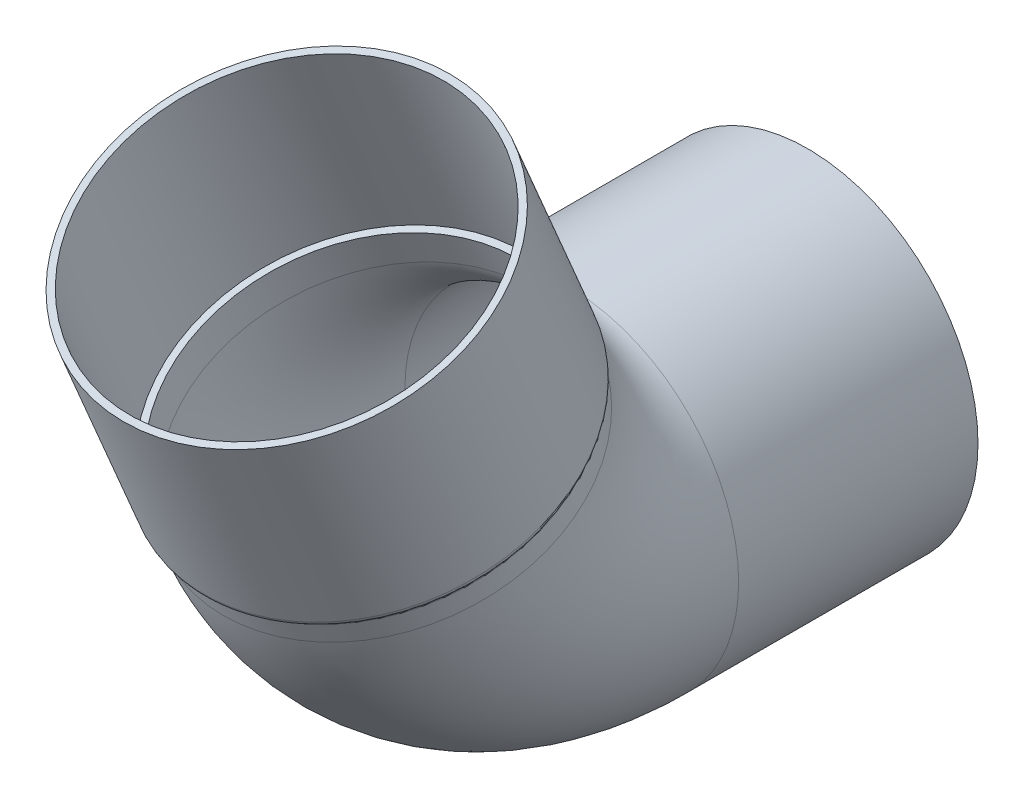
ISO-10303-21;
HEADER;
FILE_DESCRIPTION(('STEP AP214'),'2;1');
FILE_NAME('part.step','',(''),(''),'','','');
FILE_SCHEMA(('AUTOMOTIVE_DESIGN { 1 0 10303 214 1 1 1 1 }'));
ENDSEC;
DATA;
#1=APPLICATION_CONTEXT('core data for automotive mechanical design processes');
#2=APPLICATION_PROTOCOL_DEFINITION('international standard','automotive_design',2000,#1);
#3=PRODUCT_CONTEXT('',#1,'mechanical');
#4=PRODUCT('Part','Part','',(#3));
#5=PRODUCT_RELATED_PRODUCT_CATEGORY('part','',(#4));
#6=PRODUCT_DEFINITION_FORMATION('','',#4);
#7=PRODUCT_DEFINITION_CONTEXT('part definition',#1,'design');
#8=PRODUCT_DEFINITION('design','',#6,#7);
#9=PRODUCT_DEFINITION_SHAPE('','',#8);
#10=(LENGTH_UNIT() NAMED_UNIT(*) SI_UNIT(.MILLI.,.METRE.));
#11=(NAMED_UNIT(*) PLANE_ANGLE_UNIT() SI_UNIT($,.RADIAN.));
#12=(NAMED_UNIT(*) SI_UNIT($,.STERADIAN.) SOLID_ANGLE_UNIT());
#13=UNCERTAINTY_MEASURE_WITH_UNIT(LENGTH_MEASURE(1.E-05),#10,'distance_accuracy_value','');
#14=(GEOMETRIC_REPRESENTATION_CONTEXT(3) GLOBAL_UNCERTAINTY_ASSIGNED_CONTEXT((#13)) GLOBAL_UNIT_ASSIGNED_CONTEXT((#10,
#11,#12)) REPRESENTATION_CONTEXT('',''));
#15=CARTESIAN_POINT('',(0.,0.,0.));
#16=DIRECTION('',(0.,0.,1.));
#17=DIRECTION('',(1.,0.,0.));
#18=AXIS2_PLACEMENT_3D('',#15,#16,#17);
#19=CARTESIAN_POINT('',(0.,18.2780661453218,62.7585787677024));
#20=DIRECTION('',(0.,0.920504853452442,0.390731128489271));
#21=DIRECTION('',(0.,-0.390731128489271,0.920504853452442));
#22=AXIS2_PLACEMENT_3D('',#19,#20,#21);
#23=CYLINDRICAL_SURFACE('',#22,25.);
#24=CARTESIAN_POINT('',(0.,21.1716116294062,63.9868159552533));
#25=DIRECTION('',(0.,0.920504853452441,0.390731128489272));
#26=DIRECTION('',(0.,-0.390731128489272,0.920504853452441));
#27=AXIS2_PLACEMENT_3D('',#24,#25,#26);
#28=CIRCLE('',#27,25.);
#29=CARTESIAN_POINT('',(0.,11.4033334171744,86.9994372915643));
#30=VERTEX_POINT('',#29);
#31=EDGE_CURVE('E54',#30,#30,#28,.F.);
#32=ORIENTED_EDGE('',*,*,#31,.T.);
#33=EDGE_LOOP('',(#32));
#34=FACE_BOUND('',#33,.T.);
#35=CARTESIAN_POINT('',(0.,18.2780661453218,62.7585787677024));
#36=DIRECTION('',(0.,0.920504853452441,0.390731128489272));
#37=DIRECTION('',(1.,0.,0.));
#38=AXIS2_PLACEMENT_3D('',#35,#36,#37);
#39=CIRCLE('',#38,25.);
#40=CARTESIAN_POINT('',(0.,8.50978793309004,85.7712001040135));
#41=VERTEX_POINT('',#40);
#42=EDGE_CURVE('E63',#41,#41,#39,.T.);
#43=ORIENTED_EDGE('',*,*,#42,.T.);
#44=EDGE_LOOP('',(#43));
#45=FACE_BOUND('',#44,.T.);
#46=ADVANCED_FACE('F43',(#34,#45),#23,.T.);
#47=CARTESIAN_POINT('',(0.,30.,35.1434331641292));
#48=DIRECTION('',(-1.,0.,0.));
#49=DIRECTION('',(0.,0.,1.));
#50=AXIS2_PLACEMENT_3D('',#47,#48,#49);
#51=TOROIDAL_SURFACE('',#50,30.,25.);
#52=CARTESIAN_POINT('',(0.,0.,35.1434331641292));
#53=DIRECTION('',(0.,0.,1.));
#54=DIRECTION('',(1.,0.,0.));
#55=AXIS2_PLACEMENT_3D('',#52,#53,#54);
#56=CIRCLE('',#55,25.);
#57=CARTESIAN_POINT('',(0.,-25.,35.1434331641292));
#58=VERTEX_POINT('',#57);
#59=EDGE_CURVE('E66',#58,#58,#56,.T.);
#60=CARTESIAN_POINT('',(0.,30.,35.1434331641292));
#61=DIRECTION('',(-1.,0.,0.));
#62=DIRECTION('',(0.,0.,1.));
#63=AXIS2_PLACEMENT_3D('',#60,#61,#62);
#64=CIRCLE('',#63,55.);
#65=EDGE_CURVE('',#58,#41,#64,.T.);
#66=ORIENTED_EDGE('',*,*,#59,.T.);
#67=ORIENTED_EDGE('',*,*,#42,.F.);
#68=ORIENTED_EDGE('',*,*,#65,.T.);
#69=ORIENTED_EDGE('',*,*,#65,.F.);
#70=EDGE_LOOP('',(#66,#68,#67,#69));
#71=FACE_BOUND('',#70,.T.);
#72=ADVANCED_FACE('F109',(#71),#51,.T.);
#73=CARTESIAN_POINT('',(0.,0.,35.1434331641292));
#74=DIRECTION('',(0.,0.,-1.));
#75=DIRECTION('',(0.,1.,0.));
#76=AXIS2_PLACEMENT_3D('',#73,#74,#75);
#77=CYLINDRICAL_SURFACE('',#76,25.);
#78=ORIENTED_EDGE('',*,*,#59,.F.);
#79=EDGE_LOOP('',(#78));
#80=FACE_BOUND('',#79,.T.);
#81=CARTESIAN_POINT('',(0.,0.,0.));
#82=DIRECTION('',(0.,0.,1.));
#83=DIRECTION('',(1.,0.,0.));
#84=AXIS2_PLACEMENT_3D('',#81,#82,#83);
#85=CIRCLE('',#84,25.);
#86=CARTESIAN_POINT('',(25.,0.,0.));
#87=VERTEX_POINT('',#86);
#88=EDGE_CURVE('E67',#87,#87,#85,.T.);
#89=ORIENTED_EDGE('',*,*,#88,.T.);
#90=EDGE_LOOP('',(#89));
#91=FACE_BOUND('',#90,.T.);
#92=ADVANCED_FACE('F115',(#80,#91),#77,.T.);
#93=CARTESIAN_POINT('',(0.,0.,0.));
#94=DIRECTION('',(0.,0.,1.));
#95=DIRECTION('',(1.,0.,0.));
#96=AXIS2_PLACEMENT_3D('',#93,#94,#95);
#97=PLANE('',#96);
#98=CARTESIAN_POINT('',(0.,0.,0.));
#99=DIRECTION('',(0.,0.,1.));
#100=DIRECTION('',(1.,0.,0.));
#101=AXIS2_PLACEMENT_3D('',#98,#99,#100);
#102=CIRCLE('',#101,24.);
#103=CARTESIAN_POINT('',(24.,0.,0.));
#104=VERTEX_POINT('',#103);
#105=EDGE_CURVE('E73',#104,#104,#102,.T.);
#106=ORIENTED_EDGE('',*,*,#105,.T.);
#107=EDGE_LOOP('',(#106));
#108=FACE_BOUND('',#107,.T.);
#109=ORIENTED_EDGE('',*,*,#88,.F.);
#110=EDGE_LOOP('',(#109));
#111=FACE_BOUND('',#110,.T.);
#112=ADVANCED_FACE('F178',(#108,#111),#97,.F.);
#113=CARTESIAN_POINT('',(0.,18.2780661453218,62.7585787677024));
#114=DIRECTION('',(0.,0.920504853452442,0.390731128489271));
#115=DIRECTION('',(0.,-0.390731128489271,0.920504853452442));
#116=AXIS2_PLACEMENT_3D('',#113,#114,#115);
#117=CYLINDRICAL_SURFACE('',#116,24.);
#118=CARTESIAN_POINT('',(0.,18.2780661453218,62.7585787677024));
#119=DIRECTION('',(0.,0.920504853452442,0.390731128489271));
#120=DIRECTION('',(0.,-0.390731128489271,0.920504853452442));
#121=AXIS2_PLACEMENT_3D('',#118,#119,#120);
#122=CIRCLE('',#121,24.);
#123=CARTESIAN_POINT('',(0.,8.90051906157931,84.850695250561));
#124=VERTEX_POINT('',#123);
#125=EDGE_CURVE('E70',#124,#124,#122,.T.);
#126=ORIENTED_EDGE('',*,*,#125,.F.);
#127=EDGE_LOOP('',(#126));
#128=FACE_BOUND('',#127,.T.);
#129=CARTESIAN_POINT('',(0.,23.012621336311,64.7682782122318));
#130=DIRECTION('',(0.,0.920504853452441,0.390731128489272));
#131=DIRECTION('',(0.,-0.390731128489272,0.920504853452441));
#132=AXIS2_PLACEMENT_3D('',#129,#130,#131);
#133=CIRCLE('',#132,24.);
#134=CARTESIAN_POINT('',(0.,13.6350742525685,86.8603946950904));
#135=VERTEX_POINT('',#134);
#136=EDGE_CURVE('E77',#135,#135,#133,.T.);
#137=ORIENTED_EDGE('',*,*,#136,.T.);
#138=EDGE_LOOP('',(#137));
#139=FACE_BOUND('',#138,.T.);
#140=ADVANCED_FACE('F173',(#128,#139),#117,.F.);
#141=CARTESIAN_POINT('',(0.,30.,35.1434331641292));
#142=DIRECTION('',(-1.,0.,0.));
#143=DIRECTION('',(0.,0.,1.));
#144=AXIS2_PLACEMENT_3D('',#141,#142,#143);
#145=TOROIDAL_SURFACE('',#144,30.,24.);
#146=CARTESIAN_POINT('',(0.,0.,35.1434331641292));
#147=DIRECTION('',(0.,0.,-1.));
#148=DIRECTION('',(0.,1.,0.));
#149=AXIS2_PLACEMENT_3D('',#146,#147,#148);
#150=CIRCLE('',#149,24.);
#151=CARTESIAN_POINT('',(0.,-24.,35.1434331641292));
#152=VERTEX_POINT('',#151);
#153=EDGE_CURVE('E76',#152,#152,#150,.F.);
#154=CARTESIAN_POINT('',(0.,30.,35.1434331641292));
#155=DIRECTION('',(-1.,0.,0.));
#156=DIRECTION('',(0.,0.,1.));
#157=AXIS2_PLACEMENT_3D('',#154,#155,#156);
#158=CIRCLE('',#157,54.);
#159=EDGE_CURVE('',#152,#124,#158,.T.);
#160=ORIENTED_EDGE('',*,*,#153,.F.);
#161=ORIENTED_EDGE('',*,*,#125,.T.);
#162=ORIENTED_EDGE('',*,*,#159,.T.);
#163=ORIENTED_EDGE('',*,*,#159,.F.);
#164=EDGE_LOOP('',(#160,#162,#161,#163));
#165=FACE_BOUND('',#164,.T.);
#166=ADVANCED_FACE('F177',(#165),#145,.F.);
#167=CARTESIAN_POINT('',(0.,0.,35.1434331641292));
#168=DIRECTION('',(0.,0.,-1.));
#169=DIRECTION('',(0.,1.,0.));
#170=AXIS2_PLACEMENT_3D('',#167,#168,#169);
#171=CYLINDRICAL_SURFACE('',#170,24.);
#172=ORIENTED_EDGE('',*,*,#153,.T.);
#173=EDGE_LOOP('',(#172));
#174=FACE_BOUND('',#173,.T.);
#175=ORIENTED_EDGE('',*,*,#105,.F.);
#176=EDGE_LOOP('',(#175));
#177=FACE_BOUND('',#176,.T.);
#178=ADVANCED_FACE('F166',(#174,#177),#171,.F.);
#179=CARTESIAN_POINT('',(0.,23.012621336311,64.7682782122318));
#180=DIRECTION('',(0.,0.920504853452441,0.390731128489272));
#181=DIRECTION('',(0.,-0.390731128489272,0.920504853452441));
#182=AXIS2_PLACEMENT_3D('',#179,#180,#181);
#183=PLANE('',#182);
#184=CARTESIAN_POINT('',(0.,23.0126213363111,64.7682782122318));
#185=DIRECTION('',(0.,0.920504853452441,0.390731128489272));
#186=DIRECTION('',(0.,-0.390731128489272,0.920504853452441));
#187=AXIS2_PLACEMENT_3D('',#184,#185,#186);
#188=CIRCLE('',#187,25.);
#189=CARTESIAN_POINT('',(0.,13.2443431240793,87.7808995485428));
#190=VERTEX_POINT('',#189);
#191=EDGE_CURVE('E58',#190,#190,#188,.F.);
#192=ORIENTED_EDGE('',*,*,#191,.F.);
#193=EDGE_LOOP('',(#192));
#194=FACE_BOUND('',#193,.T.);
#195=ORIENTED_EDGE('',*,*,#136,.F.);
#196=EDGE_LOOP('',(#195));
#197=FACE_BOUND('',#196,.T.);
#198=ADVANCED_FACE('F105',(#194,#197),#183,.T.);
#199=CARTESIAN_POINT('',(0.,23.012621336311,64.7682782122318));
#200=DIRECTION('',(0.,-0.920504853452441,-0.390731128489272));
#201=DIRECTION('',(0.,0.390731128489272,-0.920504853452441));
#202=AXIS2_PLACEMENT_3D('',#199,#200,#201);
#203=CYLINDRICAL_SURFACE('',#202,26.);
#204=CARTESIAN_POINT('',(0.,22.7659728042,64.6635821218956));
#205=DIRECTION('',(0.,-0.920504853452441,-0.390731128489272));
#206=DIRECTION('',(0.,0.390731128489272,-0.920504853452441));
#207=AXIS2_PLACEMENT_3D('',#204,#205,#206);
#208=CIRCLE('',#207,26.);
#209=CARTESIAN_POINT('',(0.,32.924982144921,40.7304559321321));
#210=VERTEX_POINT('',#209);
#211=EDGE_CURVE('E50',#210,#210,#208,.F.);
#212=ORIENTED_EDGE('',*,*,#211,.T.);
#213=EDGE_LOOP('',(#212));
#214=FACE_BOUND('',#213,.T.);
#215=CARTESIAN_POINT('',(0.,50.6277669398843,76.4902120669099));
#216=DIRECTION('',(0.,0.920504853452441,0.390731128489272));
#217=DIRECTION('',(0.,-0.390731128489272,0.920504853452441));
#218=AXIS2_PLACEMENT_3D('',#215,#216,#217);
#219=CIRCLE('',#218,26.);
#220=CARTESIAN_POINT('',(0.,40.4687575991632,100.423338256673));
#221=VERTEX_POINT('',#220);
#222=EDGE_CURVE('E84',#221,#221,#219,.T.);
#223=ORIENTED_EDGE('',*,*,#222,.F.);
#224=EDGE_LOOP('',(#223));
#225=FACE_BOUND('',#224,.T.);
#226=ADVANCED_FACE('F96',(#214,#225),#203,.T.);
#227=CARTESIAN_POINT('',(0.,50.6277669398843,76.4902120669099));
#228=DIRECTION('',(0.,0.920504853452441,0.390731128489272));
#229=DIRECTION('',(0.,-0.390731128489272,0.920504853452441));
#230=AXIS2_PLACEMENT_3D('',#227,#228,#229);
#231=PLANE('',#230);
#232=ORIENTED_EDGE('',*,*,#222,.T.);
#233=EDGE_LOOP('',(#232));
#234=FACE_BOUND('',#233,.T.);
#235=CARTESIAN_POINT('',(0.,50.6277669398843,76.4902120669099));
#236=DIRECTION('',(0.,0.920504853452441,0.390731128489272));
#237=DIRECTION('',(1.,0.,0.));
#238=AXIS2_PLACEMENT_3D('',#235,#236,#237);
#239=CIRCLE('',#238,25.);
#240=CARTESIAN_POINT('',(25.,50.6277669398843,76.4902120669099));
#241=VERTEX_POINT('',#240);
#242=EDGE_CURVE('E87',#241,#241,#239,.T.);
#243=ORIENTED_EDGE('',*,*,#242,.F.);
#244=EDGE_LOOP('',(#243));
#245=FACE_BOUND('',#244,.T.);
#246=ADVANCED_FACE('F94',(#234,#245),#231,.T.);
#247=CARTESIAN_POINT('',(0.,50.6277669398843,76.4902120669099));
#248=DIRECTION('',(0.,-0.920504853452441,-0.390731128489272));
#249=DIRECTION('',(0.,0.390731128489272,-0.920504853452441));
#250=AXIS2_PLACEMENT_3D('',#247,#248,#249);
#251=CYLINDRICAL_SURFACE('',#250,25.);
#252=ORIENTED_EDGE('',*,*,#242,.T.);
#253=EDGE_LOOP('',(#252));
#254=FACE_BOUND('',#253,.T.);
#255=ORIENTED_EDGE('',*,*,#191,.T.);
#256=EDGE_LOOP('',(#255));
#257=FACE_BOUND('',#256,.T.);
#258=ADVANCED_FACE('F91',(#254,#257),#251,.F.);
#259=CARTESIAN_POINT('',(0.,21.1716116294062,63.9868159552533));
#260=DIRECTION('',(0.,0.920504853452441,0.390731128489272));
#261=DIRECTION('',(0.,-0.390731128489272,0.920504853452441));
#262=AXIS2_PLACEMENT_3D('',#259,#260,#261);
#263=TOROIDAL_SURFACE('',#262,26.,1.);
#264=CARTESIAN_POINT('',(0.,21.9687922168027,64.3251990385743));
#265=DIRECTION('',(0.,-0.920504853452441,-0.390731128489272));
#266=DIRECTION('',(0.,0.390731128489272,-0.920504853452441));
#267=AXIS2_PLACEMENT_3D('',#264,#265,#266);
#268=CIRCLE('',#267,25.5000000000003);
#269=CARTESIAN_POINT('',(0.,31.9324359932793,40.8523252755368));
#270=VERTEX_POINT('',#269);
#271=EDGE_CURVE('E11',#270,#270,#268,.T.);
#272=ORIENTED_EDGE('',*,*,#271,.T.);
#273=EDGE_LOOP('',(#272));
#274=FACE_BOUND('',#273,.T.);
#275=ORIENTED_EDGE('',*,*,#31,.F.);
#276=EDGE_LOOP('',(#275));
#277=FACE_BOUND('',#276,.T.);
#278=ADVANCED_FACE('F103',(#274,#277),#263,.F.);
#279=CARTESIAN_POINT('',(0.,22.7659728042,64.6635821218956));
#280=DIRECTION('',(0.,-0.920504853452441,-0.390731128489272));
#281=DIRECTION('',(0.,0.390731128489272,-0.920504853452441));
#282=AXIS2_PLACEMENT_3D('',#279,#280,#281);
#283=TOROIDAL_SURFACE('',#282,25.0000000000002,1.);
#284=ORIENTED_EDGE('',*,*,#271,.F.);
#285=EDGE_LOOP('',(#284));
#286=FACE_BOUND('',#285,.T.);
#287=ORIENTED_EDGE('',*,*,#211,.F.);
#288=EDGE_LOOP('',(#287));
#289=FACE_BOUND('',#288,.T.);
#290=ADVANCED_FACE('F45',(#286,#289),#283,.T.);
#291=CLOSED_SHELL('',(#46,#72,#92,#112,#140,#166,#178,#198,#226,#246,#258,#278,#290));
#292=MANIFOLD_SOLID_BREP('B2',#291);
#293=ADVANCED_BREP_SHAPE_REPRESENTATION('',(#18,#292),#14);
#294=SHAPE_DEFINITION_REPRESENTATION(#9,#293);
ENDSEC;
END-ISO-10303-21;
